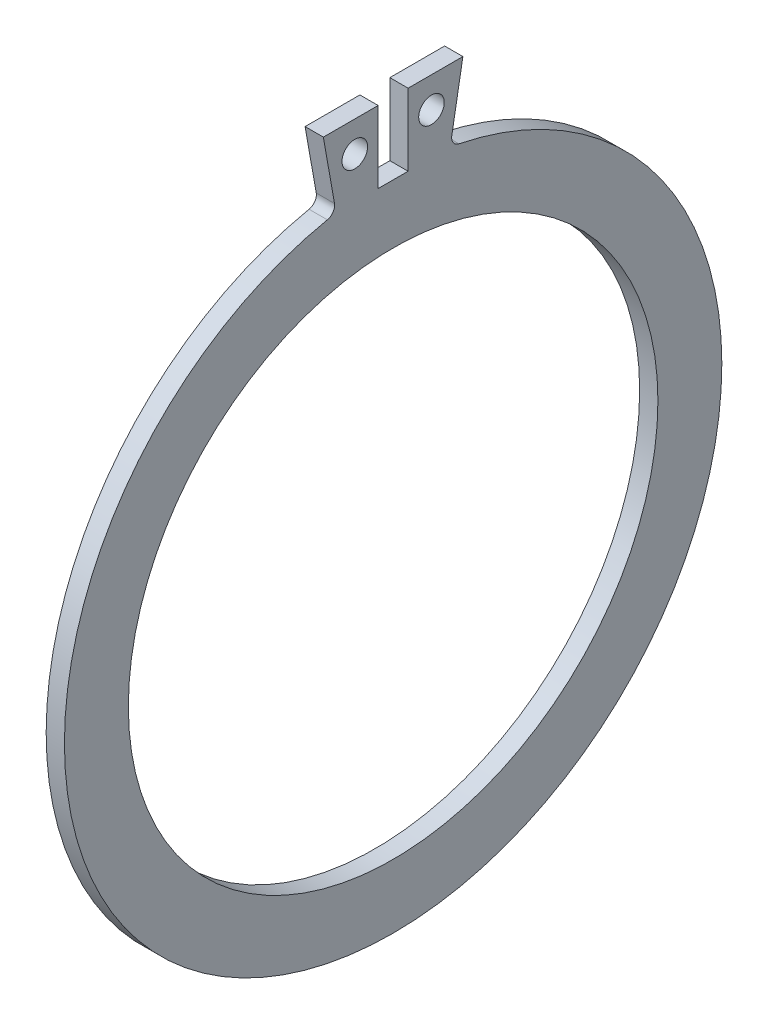
ISO-10303-21;
HEADER;
FILE_DESCRIPTION(('STEP AP214'),'2;1');
FILE_NAME('part.step','',(''),(''),'','','');
FILE_SCHEMA(('AUTOMOTIVE_DESIGN { 1 0 10303 214 1 1 1 1 }'));
ENDSEC;
DATA;
#1=APPLICATION_CONTEXT('core data for automotive mechanical design processes');
#2=APPLICATION_PROTOCOL_DEFINITION('international standard','automotive_design',2000,#1);
#3=PRODUCT_CONTEXT('',#1,'mechanical');
#4=PRODUCT('Part','Part','',(#3));
#5=PRODUCT_RELATED_PRODUCT_CATEGORY('part','',(#4));
#6=PRODUCT_DEFINITION_FORMATION('','',#4);
#7=PRODUCT_DEFINITION_CONTEXT('part definition',#1,'design');
#8=PRODUCT_DEFINITION('design','',#6,#7);
#9=PRODUCT_DEFINITION_SHAPE('','',#8);
#10=(LENGTH_UNIT() NAMED_UNIT(*) SI_UNIT(.MILLI.,.METRE.));
#11=(NAMED_UNIT(*) PLANE_ANGLE_UNIT() SI_UNIT($,.RADIAN.));
#12=(NAMED_UNIT(*) SI_UNIT($,.STERADIAN.) SOLID_ANGLE_UNIT());
#13=UNCERTAINTY_MEASURE_WITH_UNIT(LENGTH_MEASURE(1.E-05),#10,'distance_accuracy_value','');
#14=(GEOMETRIC_REPRESENTATION_CONTEXT(3) GLOBAL_UNCERTAINTY_ASSIGNED_CONTEXT((#13)) GLOBAL_UNIT_ASSIGNED_CONTEXT((#10,
#11,#12)) REPRESENTATION_CONTEXT('',''));
#15=CARTESIAN_POINT('',(0.,0.,0.));
#16=DIRECTION('',(0.,0.,1.));
#17=DIRECTION('',(1.,0.,0.));
#18=AXIS2_PLACEMENT_3D('',#15,#16,#17);
#19=CARTESIAN_POINT('',(1.,18.1254640198692,-3.70372165050624));
#20=DIRECTION('',(-1.,0.,0.));
#21=DIRECTION('',(0.,0.,1.));
#22=AXIS2_PLACEMENT_3D('',#19,#20,#21);
#23=PLANE('',#22);
#24=DIRECTION('',(0.,0.,1.));
#25=VECTOR('',#24,1.);
#26=CARTESIAN_POINT('',(1.,21.6657705662686,3.82025990867254));
#27=LINE('',#26,#25);
#28=CARTESIAN_POINT('',(1.,21.6657705662686,0.820259908672544));
#29=VERTEX_POINT('',#28);
#30=CARTESIAN_POINT('',(1.,21.6657705662686,3.82025990867254));
#31=VERTEX_POINT('',#30);
#32=EDGE_CURVE('E182',#29,#31,#27,.T.);
#33=ORIENTED_EDGE('',*,*,#32,.T.);
#34=DIRECTION('',(0.,-0.984807753012208,-0.173648177666934));
#35=VECTOR('',#34,1.);
#36=CARTESIAN_POINT('',(1.,18.2122881087026,3.21131777400027));
#37=LINE('',#36,#35);
#38=CARTESIAN_POINT('',(1.,18.2122881087026,3.21131777400027));
#39=VERTEX_POINT('',#38);
#40=EDGE_CURVE('E106',#31,#39,#37,.T.);
#41=ORIENTED_EDGE('',*,*,#40,.T.);
#42=CARTESIAN_POINT('',(1.,18.1254640198691,3.70372165050638));
#43=DIRECTION('',(-1.,0.,0.));
#44=DIRECTION('',(0.,0.,-1.));
#45=AXIS2_PLACEMENT_3D('',#42,#43,#44);
#46=CIRCLE('',#45,0.499999999999998);
#47=CARTESIAN_POINT('',(1.,17.6355866139267,3.60362106535756));
#48=VERTEX_POINT('',#47);
#49=EDGE_CURVE('E211',#39,#48,#46,.T.);
#50=ORIENTED_EDGE('',*,*,#49,.T.);
#51=CARTESIAN_POINT('',(1.,0.,0.));
#52=DIRECTION('',(1.,0.,0.));
#53=DIRECTION('',(0.,0.,-1.));
#54=AXIS2_PLACEMENT_3D('',#51,#52,#53);
#55=CIRCLE('',#54,18.);
#56=CARTESIAN_POINT('',(1.,17.6355866139267,-3.60362106535743));
#57=VERTEX_POINT('',#56);
#58=EDGE_CURVE('E231',#48,#57,#55,.T.);
#59=ORIENTED_EDGE('',*,*,#58,.T.);
#60=CARTESIAN_POINT('',(1.,18.1254640198692,-3.70372165050624));
#61=DIRECTION('',(-1.,0.,0.));
#62=DIRECTION('',(0.,0.,1.));
#63=AXIS2_PLACEMENT_3D('',#60,#61,#62);
#64=CIRCLE('',#63,0.499999999999997);
#65=CARTESIAN_POINT('',(1.,18.2122881087026,-3.21131777400014));
#66=VERTEX_POINT('',#65);
#67=EDGE_CURVE('E227',#57,#66,#64,.T.);
#68=ORIENTED_EDGE('',*,*,#67,.T.);
#69=DIRECTION('',(0.,0.984807753012209,-0.173648177666926));
#70=VECTOR('',#69,1.);
#71=CARTESIAN_POINT('',(1.,18.2122881087026,-3.21131777400014));
#72=LINE('',#71,#70);
#73=CARTESIAN_POINT('',(1.,21.6657705662686,-3.82025990867238));
#74=VERTEX_POINT('',#73);
#75=EDGE_CURVE('E230',#66,#74,#72,.T.);
#76=ORIENTED_EDGE('',*,*,#75,.T.);
#77=DIRECTION('',(0.,0.,1.));
#78=VECTOR('',#77,1.);
#79=CARTESIAN_POINT('',(1.,21.6657705662686,-3.82025990867238));
#80=LINE('',#79,#78);
#81=CARTESIAN_POINT('',(1.,21.6657705662686,-0.820259908672379));
#82=VERTEX_POINT('',#81);
#83=EDGE_CURVE('E131',#74,#82,#80,.T.);
#84=ORIENTED_EDGE('',*,*,#83,.T.);
#85=DIRECTION('',(0.,-1.,0.));
#86=VECTOR('',#85,1.);
#87=CARTESIAN_POINT('',(1.,21.6657705662686,-0.820259908672379));
#88=LINE('',#87,#86);
#89=CARTESIAN_POINT('',(1.,17.7265395542197,-0.820259908672409));
#90=VERTEX_POINT('',#89);
#91=EDGE_CURVE('E125',#82,#90,#88,.T.);
#92=ORIENTED_EDGE('',*,*,#91,.T.);
#93=DIRECTION('',(0.,0.,1.));
#94=VECTOR('',#93,1.);
#95=CARTESIAN_POINT('',(1.,17.7265395542197,0.820259908672543));
#96=LINE('',#95,#94);
#97=CARTESIAN_POINT('',(1.,17.7265395542197,0.820259908672543));
#98=VERTEX_POINT('',#97);
#99=EDGE_CURVE('E129',#90,#98,#96,.T.);
#100=ORIENTED_EDGE('',*,*,#99,.T.);
#101=DIRECTION('',(0.,1.,0.));
#102=VECTOR('',#101,1.);
#103=CARTESIAN_POINT('',(1.,21.6657705662686,0.820259908672544));
#104=LINE('',#103,#102);
#105=EDGE_CURVE('E57',#98,#29,#104,.T.);
#106=ORIENTED_EDGE('',*,*,#105,.T.);
#107=EDGE_LOOP('',(#33,#41,#50,#59,#68,#76,#84,#92,#100,#106));
#108=FACE_BOUND('',#107,.T.);
#109=CARTESIAN_POINT('',(1.,0.,0.));
#110=DIRECTION('',(1.,0.,0.));
#111=DIRECTION('',(0.,0.,-1.));
#112=AXIS2_PLACEMENT_3D('',#109,#110,#111);
#113=CIRCLE('',#112,14.5);
#114=CARTESIAN_POINT('',(1.,0.,-14.5));
#115=VERTEX_POINT('',#114);
#116=EDGE_CURVE('E158',#115,#115,#113,.T.);
#117=ORIENTED_EDGE('',*,*,#116,.F.);
#118=EDGE_LOOP('',(#117));
#119=FACE_BOUND('',#118,.T.);
#120=CARTESIAN_POINT('',(1.,20.,2.1));
#121=DIRECTION('',(1.,0.,0.));
#122=DIRECTION('',(0.,0.,-1.));
#123=AXIS2_PLACEMENT_3D('',#120,#121,#122);
#124=CIRCLE('',#123,0.699999999999999);
#125=CARTESIAN_POINT('',(1.,20.,1.4));
#126=VERTEX_POINT('',#125);
#127=EDGE_CURVE('E249',#126,#126,#124,.T.);
#128=ORIENTED_EDGE('',*,*,#127,.F.);
#129=EDGE_LOOP('',(#128));
#130=FACE_BOUND('',#129,.T.);
#131=CARTESIAN_POINT('',(1.,20.,-2.09999999999985));
#132=DIRECTION('',(1.,0.,0.));
#133=DIRECTION('',(0.,0.,1.));
#134=AXIS2_PLACEMENT_3D('',#131,#132,#133);
#135=CIRCLE('',#134,0.700000000000001);
#136=CARTESIAN_POINT('',(1.,20.,-1.39999999999985));
#137=VERTEX_POINT('',#136);
#138=EDGE_CURVE('E257',#137,#137,#135,.T.);
#139=ORIENTED_EDGE('',*,*,#138,.F.);
#140=EDGE_LOOP('',(#139));
#141=FACE_BOUND('',#140,.T.);
#142=ADVANCED_FACE('F39',(#108,#119,#130,#141),#23,.F.);
#143=CARTESIAN_POINT('',(0.,18.1254640198692,-3.70372165050624));
#144=DIRECTION('',(-1.,0.,0.));
#145=DIRECTION('',(0.,0.,1.));
#146=AXIS2_PLACEMENT_3D('',#143,#144,#145);
#147=PLANE('',#146);
#148=CARTESIAN_POINT('',(0.,20.,2.1));
#149=DIRECTION('',(1.,0.,0.));
#150=DIRECTION('',(0.,0.,-1.));
#151=AXIS2_PLACEMENT_3D('',#148,#149,#150);
#152=CIRCLE('',#151,0.699999999999999);
#153=CARTESIAN_POINT('',(0.,20.,1.4));
#154=VERTEX_POINT('',#153);
#155=EDGE_CURVE('E253',#154,#154,#152,.T.);
#156=ORIENTED_EDGE('',*,*,#155,.T.);
#157=EDGE_LOOP('',(#156));
#158=FACE_BOUND('',#157,.T.);
#159=DIRECTION('',(0.,0.,1.));
#160=VECTOR('',#159,1.);
#161=CARTESIAN_POINT('',(0.,21.6657705662686,3.82025990867254));
#162=LINE('',#161,#160);
#163=CARTESIAN_POINT('',(0.,21.6657705662686,0.820259908672544));
#164=VERTEX_POINT('',#163);
#165=CARTESIAN_POINT('',(0.,21.6657705662686,3.82025990867254));
#166=VERTEX_POINT('',#165);
#167=EDGE_CURVE('E153',#164,#166,#162,.T.);
#168=ORIENTED_EDGE('',*,*,#167,.F.);
#169=DIRECTION('',(0.,1.,0.));
#170=VECTOR('',#169,1.);
#171=CARTESIAN_POINT('',(0.,21.6657705662686,0.820259908672544));
#172=LINE('',#171,#170);
#173=CARTESIAN_POINT('',(0.,17.7265395542197,0.820259908672543));
#174=VERTEX_POINT('',#173);
#175=EDGE_CURVE('E98',#174,#164,#172,.T.);
#176=ORIENTED_EDGE('',*,*,#175,.F.);
#177=DIRECTION('',(0.,0.,1.));
#178=VECTOR('',#177,1.);
#179=CARTESIAN_POINT('',(0.,17.7265395542197,0.820259908672543));
#180=LINE('',#179,#178);
#181=CARTESIAN_POINT('',(0.,17.7265395542197,-0.820259908672409));
#182=VERTEX_POINT('',#181);
#183=EDGE_CURVE('E92',#182,#174,#180,.T.);
#184=ORIENTED_EDGE('',*,*,#183,.F.);
#185=DIRECTION('',(0.,-1.,0.));
#186=VECTOR('',#185,1.);
#187=CARTESIAN_POINT('',(0.,21.6657705662686,-0.820259908672379));
#188=LINE('',#187,#186);
#189=CARTESIAN_POINT('',(0.,21.6657705662686,-0.820259908672379));
#190=VERTEX_POINT('',#189);
#191=EDGE_CURVE('E140',#190,#182,#188,.T.);
#192=ORIENTED_EDGE('',*,*,#191,.F.);
#193=DIRECTION('',(0.,0.,1.));
#194=VECTOR('',#193,1.);
#195=CARTESIAN_POINT('',(0.,21.6657705662686,-3.82025990867238));
#196=LINE('',#195,#194);
#197=CARTESIAN_POINT('',(0.,21.6657705662686,-3.82025990867238));
#198=VERTEX_POINT('',#197);
#199=EDGE_CURVE('E173',#198,#190,#196,.T.);
#200=ORIENTED_EDGE('',*,*,#199,.F.);
#201=DIRECTION('',(0.,0.984807753012209,-0.173648177666926));
#202=VECTOR('',#201,1.);
#203=CARTESIAN_POINT('',(0.,18.2122881087026,-3.21131777400014));
#204=LINE('',#203,#202);
#205=CARTESIAN_POINT('',(0.,18.2122881087026,-3.21131777400014));
#206=VERTEX_POINT('',#205);
#207=EDGE_CURVE('E170',#206,#198,#204,.T.);
#208=ORIENTED_EDGE('',*,*,#207,.F.);
#209=CARTESIAN_POINT('',(0.,18.1254640198692,-3.70372165050624));
#210=DIRECTION('',(-1.,0.,0.));
#211=DIRECTION('',(0.,0.,1.));
#212=AXIS2_PLACEMENT_3D('',#209,#210,#211);
#213=CIRCLE('',#212,0.499999999999997);
#214=CARTESIAN_POINT('',(0.,17.6355866139267,-3.60362106535743));
#215=VERTEX_POINT('',#214);
#216=EDGE_CURVE('E167',#215,#206,#213,.T.);
#217=ORIENTED_EDGE('',*,*,#216,.F.);
#218=CARTESIAN_POINT('',(0.,0.,0.));
#219=DIRECTION('',(1.,0.,0.));
#220=DIRECTION('',(0.,0.,-1.));
#221=AXIS2_PLACEMENT_3D('',#218,#219,#220);
#222=CIRCLE('',#221,18.);
#223=CARTESIAN_POINT('',(0.,17.6355866139267,3.60362106535756));
#224=VERTEX_POINT('',#223);
#225=EDGE_CURVE('E164',#224,#215,#222,.T.);
#226=ORIENTED_EDGE('',*,*,#225,.F.);
#227=CARTESIAN_POINT('',(0.,18.1254640198691,3.70372165050638));
#228=DIRECTION('',(-1.,0.,0.));
#229=DIRECTION('',(0.,0.,-1.));
#230=AXIS2_PLACEMENT_3D('',#227,#228,#229);
#231=CIRCLE('',#230,0.499999999999998);
#232=CARTESIAN_POINT('',(0.,18.2122881087026,3.21131777400027));
#233=VERTEX_POINT('',#232);
#234=EDGE_CURVE('E161',#233,#224,#231,.T.);
#235=ORIENTED_EDGE('',*,*,#234,.F.);
#236=DIRECTION('',(0.,-0.984807753012208,-0.173648177666934));
#237=VECTOR('',#236,1.);
#238=CARTESIAN_POINT('',(0.,18.2122881087026,3.21131777400027));
#239=LINE('',#238,#237);
#240=EDGE_CURVE('E157',#166,#233,#239,.T.);
#241=ORIENTED_EDGE('',*,*,#240,.F.);
#242=EDGE_LOOP('',(#168,#176,#184,#192,#200,#208,#217,#226,#235,#241));
#243=FACE_BOUND('',#242,.T.);
#244=CARTESIAN_POINT('',(0.,0.,0.));
#245=DIRECTION('',(1.,0.,0.));
#246=DIRECTION('',(0.,0.,-1.));
#247=AXIS2_PLACEMENT_3D('',#244,#245,#246);
#248=CIRCLE('',#247,14.5);
#249=CARTESIAN_POINT('',(0.,0.,-14.5));
#250=VERTEX_POINT('',#249);
#251=EDGE_CURVE('E245',#250,#250,#248,.T.);
#252=ORIENTED_EDGE('',*,*,#251,.T.);
#253=EDGE_LOOP('',(#252));
#254=FACE_BOUND('',#253,.T.);
#255=CARTESIAN_POINT('',(0.,20.,-2.09999999999985));
#256=DIRECTION('',(1.,0.,0.));
#257=DIRECTION('',(0.,0.,1.));
#258=AXIS2_PLACEMENT_3D('',#255,#256,#257);
#259=CIRCLE('',#258,0.700000000000001);
#260=CARTESIAN_POINT('',(0.,20.,-1.39999999999985));
#261=VERTEX_POINT('',#260);
#262=EDGE_CURVE('E261',#261,#261,#259,.T.);
#263=ORIENTED_EDGE('',*,*,#262,.T.);
#264=EDGE_LOOP('',(#263));
#265=FACE_BOUND('',#264,.T.);
#266=ADVANCED_FACE('F215',(#158,#243,#254,#265),#147,.T.);
#267=CARTESIAN_POINT('',(1.,21.6657705662686,3.82025990867254));
#268=DIRECTION('',(0.,-1.,0.));
#269=DIRECTION('',(0.,0.,-1.));
#270=AXIS2_PLACEMENT_3D('',#267,#268,#269);
#271=PLANE('',#270);
#272=ORIENTED_EDGE('',*,*,#167,.T.);
#273=DIRECTION('',(-1.,0.,0.));
#274=VECTOR('',#273,1.);
#275=CARTESIAN_POINT('',(1.,21.6657705662686,3.82025990867254));
#276=LINE('',#275,#274);
#277=EDGE_CURVE('E11',#31,#166,#276,.T.);
#278=ORIENTED_EDGE('',*,*,#277,.F.);
#279=ORIENTED_EDGE('',*,*,#32,.F.);
#280=DIRECTION('',(-1.,0.,0.));
#281=VECTOR('',#280,1.);
#282=CARTESIAN_POINT('',(1.,21.6657705662686,0.820259908672544));
#283=LINE('',#282,#281);
#284=EDGE_CURVE('E149',#29,#164,#283,.T.);
#285=ORIENTED_EDGE('',*,*,#284,.T.);
#286=EDGE_LOOP('',(#272,#278,#279,#285));
#287=FACE_BOUND('',#286,.T.);
#288=ADVANCED_FACE('F41',(#287),#271,.F.);
#289=CARTESIAN_POINT('',(1.,18.2122881087026,3.21131777400027));
#290=DIRECTION('',(0.,0.173648177666934,-0.984807753012207));
#291=DIRECTION('',(0.,0.984807753012208,0.173648177666934));
#292=AXIS2_PLACEMENT_3D('',#289,#290,#291);
#293=PLANE('',#292);
#294=ORIENTED_EDGE('',*,*,#240,.T.);
#295=DIRECTION('',(-1.,0.,0.));
#296=VECTOR('',#295,1.);
#297=CARTESIAN_POINT('',(1.,18.2122881087026,3.21131777400027));
#298=LINE('',#297,#296);
#299=EDGE_CURVE('E49',#39,#233,#298,.T.);
#300=ORIENTED_EDGE('',*,*,#299,.F.);
#301=ORIENTED_EDGE('',*,*,#40,.F.);
#302=ORIENTED_EDGE('',*,*,#277,.T.);
#303=EDGE_LOOP('',(#294,#300,#301,#302));
#304=FACE_BOUND('',#303,.T.);
#305=ADVANCED_FACE('F303',(#304),#293,.F.);
#306=CARTESIAN_POINT('',(1.,18.1254640198691,3.70372165050638));
#307=DIRECTION('',(-1.,0.,0.));
#308=DIRECTION('',(0.,0.,1.));
#309=AXIS2_PLACEMENT_3D('',#306,#307,#308);
#310=CYLINDRICAL_SURFACE('',#309,0.499999999999998);
#311=ORIENTED_EDGE('',*,*,#234,.T.);
#312=DIRECTION('',(-1.,0.,0.));
#313=VECTOR('',#312,1.);
#314=CARTESIAN_POINT('',(1.,17.6355866139267,3.60362106535756));
#315=LINE('',#314,#313);
#316=EDGE_CURVE('E201',#48,#224,#315,.T.);
#317=ORIENTED_EDGE('',*,*,#316,.F.);
#318=ORIENTED_EDGE('',*,*,#49,.F.);
#319=ORIENTED_EDGE('',*,*,#299,.T.);
#320=EDGE_LOOP('',(#311,#317,#318,#319));
#321=FACE_BOUND('',#320,.T.);
#322=ADVANCED_FACE('F209',(#321),#310,.F.);
#323=CARTESIAN_POINT('',(1.,0.,0.));
#324=DIRECTION('',(-1.,0.,0.));
#325=DIRECTION('',(0.,0.,1.));
#326=AXIS2_PLACEMENT_3D('',#323,#324,#325);
#327=CYLINDRICAL_SURFACE('',#326,18.);
#328=ORIENTED_EDGE('',*,*,#225,.T.);
#329=DIRECTION('',(-1.,0.,0.));
#330=VECTOR('',#329,1.);
#331=CARTESIAN_POINT('',(1.,17.6355866139267,-3.60362106535743));
#332=LINE('',#331,#330);
#333=EDGE_CURVE('E197',#57,#215,#332,.T.);
#334=ORIENTED_EDGE('',*,*,#333,.F.);
#335=ORIENTED_EDGE('',*,*,#58,.F.);
#336=ORIENTED_EDGE('',*,*,#316,.T.);
#337=EDGE_LOOP('',(#328,#334,#335,#336));
#338=FACE_BOUND('',#337,.T.);
#339=ADVANCED_FACE('F221',(#338),#327,.T.);
#340=CARTESIAN_POINT('',(1.,18.1254640198692,-3.70372165050624));
#341=DIRECTION('',(-1.,0.,0.));
#342=DIRECTION('',(0.,0.,1.));
#343=AXIS2_PLACEMENT_3D('',#340,#341,#342);
#344=CYLINDRICAL_SURFACE('',#343,0.499999999999997);
#345=ORIENTED_EDGE('',*,*,#216,.T.);
#346=DIRECTION('',(-1.,0.,0.));
#347=VECTOR('',#346,1.);
#348=CARTESIAN_POINT('',(1.,18.2122881087026,-3.21131777400014));
#349=LINE('',#348,#347);
#350=EDGE_CURVE('E193',#66,#206,#349,.T.);
#351=ORIENTED_EDGE('',*,*,#350,.F.);
#352=ORIENTED_EDGE('',*,*,#67,.F.);
#353=ORIENTED_EDGE('',*,*,#333,.T.);
#354=EDGE_LOOP('',(#345,#351,#352,#353));
#355=FACE_BOUND('',#354,.T.);
#356=ADVANCED_FACE('F225',(#355),#344,.F.);
#357=CARTESIAN_POINT('',(1.,18.2122881087026,-3.21131777400014));
#358=DIRECTION('',(0.,0.173648177666926,0.984807753012209));
#359=DIRECTION('',(0.,-0.984807753012209,0.173648177666926));
#360=AXIS2_PLACEMENT_3D('',#357,#358,#359);
#361=PLANE('',#360);
#362=ORIENTED_EDGE('',*,*,#207,.T.);
#363=DIRECTION('',(-1.,0.,0.));
#364=VECTOR('',#363,1.);
#365=CARTESIAN_POINT('',(1.,21.6657705662686,-3.82025990867238));
#366=LINE('',#365,#364);
#367=EDGE_CURVE('E189',#74,#198,#366,.T.);
#368=ORIENTED_EDGE('',*,*,#367,.F.);
#369=ORIENTED_EDGE('',*,*,#75,.F.);
#370=ORIENTED_EDGE('',*,*,#350,.T.);
#371=EDGE_LOOP('',(#362,#368,#369,#370));
#372=FACE_BOUND('',#371,.T.);
#373=ADVANCED_FACE('F293',(#372),#361,.F.);
#374=CARTESIAN_POINT('',(1.,21.6657705662686,-3.82025990867238));
#375=DIRECTION('',(0.,-1.,0.));
#376=DIRECTION('',(0.,0.,-1.));
#377=AXIS2_PLACEMENT_3D('',#374,#375,#376);
#378=PLANE('',#377);
#379=ORIENTED_EDGE('',*,*,#199,.T.);
#380=DIRECTION('',(-1.,0.,0.));
#381=VECTOR('',#380,1.);
#382=CARTESIAN_POINT('',(1.,21.6657705662686,-0.820259908672379));
#383=LINE('',#382,#381);
#384=EDGE_CURVE('E142',#82,#190,#383,.T.);
#385=ORIENTED_EDGE('',*,*,#384,.F.);
#386=ORIENTED_EDGE('',*,*,#83,.F.);
#387=ORIENTED_EDGE('',*,*,#367,.T.);
#388=EDGE_LOOP('',(#379,#385,#386,#387));
#389=FACE_BOUND('',#388,.T.);
#390=ADVANCED_FACE('F290',(#389),#378,.F.);
#391=CARTESIAN_POINT('',(1.,21.6657705662686,-0.820259908672379));
#392=DIRECTION('',(0.,0.,-1.));
#393=DIRECTION('',(0.,1.,0.));
#394=AXIS2_PLACEMENT_3D('',#391,#392,#393);
#395=PLANE('',#394);
#396=ORIENTED_EDGE('',*,*,#191,.T.);
#397=DIRECTION('',(-1.,0.,0.));
#398=VECTOR('',#397,1.);
#399=CARTESIAN_POINT('',(1.,17.7265395542197,-0.820259908672409));
#400=LINE('',#399,#398);
#401=EDGE_CURVE('E137',#90,#182,#400,.T.);
#402=ORIENTED_EDGE('',*,*,#401,.F.);
#403=ORIENTED_EDGE('',*,*,#91,.F.);
#404=ORIENTED_EDGE('',*,*,#384,.T.);
#405=EDGE_LOOP('',(#396,#402,#403,#404));
#406=FACE_BOUND('',#405,.T.);
#407=ADVANCED_FACE('F138',(#406),#395,.F.);
#408=CARTESIAN_POINT('',(1.,17.7265395542197,0.820259908672543));
#409=DIRECTION('',(0.,-1.,0.));
#410=DIRECTION('',(0.,0.,-1.));
#411=AXIS2_PLACEMENT_3D('',#408,#409,#410);
#412=PLANE('',#411);
#413=ORIENTED_EDGE('',*,*,#183,.T.);
#414=DIRECTION('',(-1.,0.,0.));
#415=VECTOR('',#414,1.);
#416=CARTESIAN_POINT('',(1.,17.7265395542197,0.820259908672543));
#417=LINE('',#416,#415);
#418=EDGE_CURVE('E143',#98,#174,#417,.T.);
#419=ORIENTED_EDGE('',*,*,#418,.F.);
#420=ORIENTED_EDGE('',*,*,#99,.F.);
#421=ORIENTED_EDGE('',*,*,#401,.T.);
#422=EDGE_LOOP('',(#413,#419,#420,#421));
#423=FACE_BOUND('',#422,.T.);
#424=ADVANCED_FACE('F145',(#423),#412,.F.);
#425=CARTESIAN_POINT('',(1.,21.6657705662686,0.820259908672544));
#426=DIRECTION('',(0.,0.,1.));
#427=DIRECTION('',(0.,-1.,0.));
#428=AXIS2_PLACEMENT_3D('',#425,#426,#427);
#429=PLANE('',#428);
#430=ORIENTED_EDGE('',*,*,#175,.T.);
#431=ORIENTED_EDGE('',*,*,#284,.F.);
#432=ORIENTED_EDGE('',*,*,#105,.F.);
#433=ORIENTED_EDGE('',*,*,#418,.T.);
#434=EDGE_LOOP('',(#430,#431,#432,#433));
#435=FACE_BOUND('',#434,.T.);
#436=ADVANCED_FACE('F283',(#435),#429,.F.);
#437=CARTESIAN_POINT('',(1.,0.,0.));
#438=DIRECTION('',(-1.,0.,0.));
#439=DIRECTION('',(0.,0.,1.));
#440=AXIS2_PLACEMENT_3D('',#437,#438,#439);
#441=CYLINDRICAL_SURFACE('',#440,14.5);
#442=ORIENTED_EDGE('',*,*,#116,.T.);
#443=EDGE_LOOP('',(#442));
#444=FACE_BOUND('',#443,.T.);
#445=ORIENTED_EDGE('',*,*,#251,.F.);
#446=EDGE_LOOP('',(#445));
#447=FACE_BOUND('',#446,.T.);
#448=ADVANCED_FACE('F280',(#444,#447),#441,.F.);
#449=CARTESIAN_POINT('',(1.,20.,2.1));
#450=DIRECTION('',(-1.,0.,0.));
#451=DIRECTION('',(0.,0.,1.));
#452=AXIS2_PLACEMENT_3D('',#449,#450,#451);
#453=CYLINDRICAL_SURFACE('',#452,0.699999999999999);
#454=ORIENTED_EDGE('',*,*,#127,.T.);
#455=EDGE_LOOP('',(#454));
#456=FACE_BOUND('',#455,.T.);
#457=ORIENTED_EDGE('',*,*,#155,.F.);
#458=EDGE_LOOP('',(#457));
#459=FACE_BOUND('',#458,.T.);
#460=ADVANCED_FACE('F379',(#456,#459),#453,.F.);
#461=CARTESIAN_POINT('',(1.,20.,-2.09999999999985));
#462=DIRECTION('',(-1.,0.,0.));
#463=DIRECTION('',(0.,0.,1.));
#464=AXIS2_PLACEMENT_3D('',#461,#462,#463);
#465=CYLINDRICAL_SURFACE('',#464,0.700000000000001);
#466=ORIENTED_EDGE('',*,*,#138,.T.);
#467=EDGE_LOOP('',(#466));
#468=FACE_BOUND('',#467,.T.);
#469=ORIENTED_EDGE('',*,*,#262,.F.);
#470=EDGE_LOOP('',(#469));
#471=FACE_BOUND('',#470,.T.);
#472=ADVANCED_FACE('F269',(#468,#471),#465,.F.);
#473=CLOSED_SHELL('',(#142,#266,#288,#305,#322,#339,#356,#373,#390,#407,#424,#436,#448,#460,#472));
#474=MANIFOLD_SOLID_BREP('B2',#473);
#475=ADVANCED_BREP_SHAPE_REPRESENTATION('',(#18,#474),#14);
#476=SHAPE_DEFINITION_REPRESENTATION(#9,#475);
ENDSEC;
END-ISO-10303-21;
